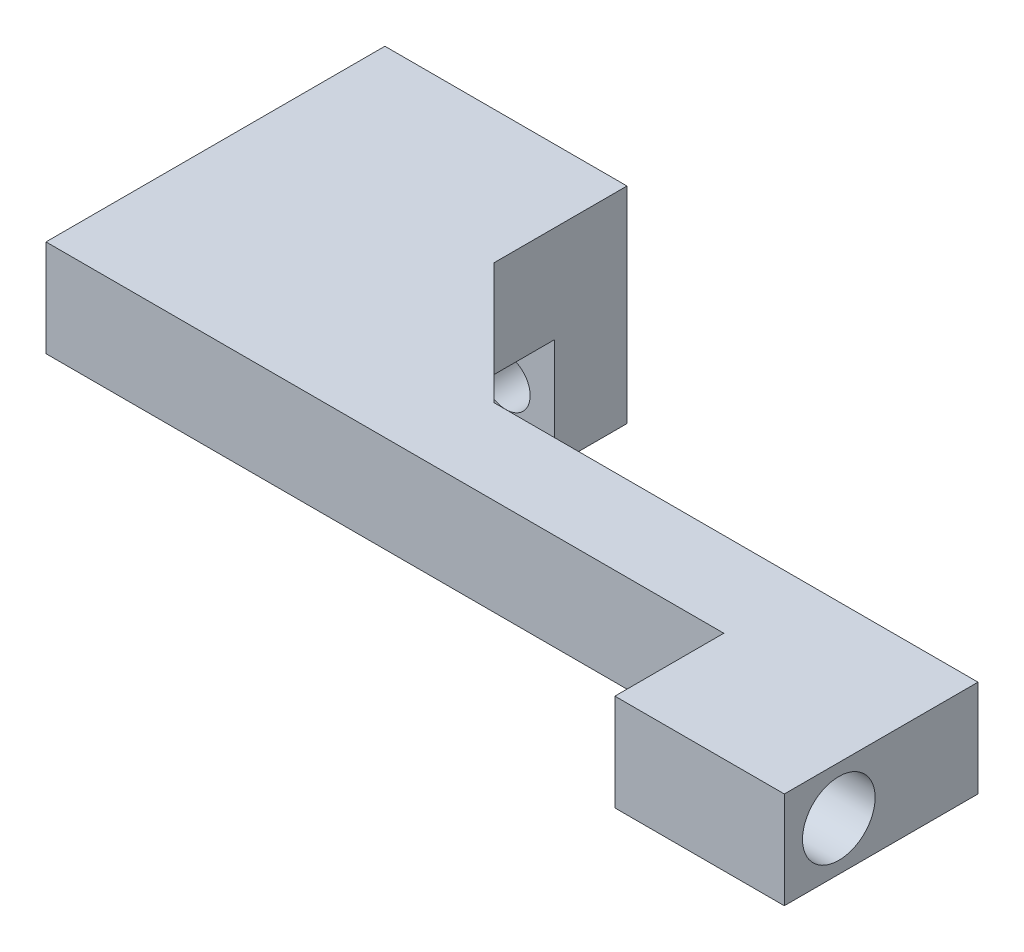
ISO-10303-21;
HEADER;
FILE_DESCRIPTION(('STEP AP214'),'2;1');
FILE_NAME('part.step','',(''),(''),'','','');
FILE_SCHEMA(('AUTOMOTIVE_DESIGN { 1 0 10303 214 1 1 1 1 }'));
ENDSEC;
DATA;
#1=APPLICATION_CONTEXT('core data for automotive mechanical design processes');
#2=APPLICATION_PROTOCOL_DEFINITION('international standard','automotive_design',2000,#1);
#3=PRODUCT_CONTEXT('',#1,'mechanical');
#4=PRODUCT('Part','Part','',(#3));
#5=PRODUCT_RELATED_PRODUCT_CATEGORY('part','',(#4));
#6=PRODUCT_DEFINITION_FORMATION('','',#4);
#7=PRODUCT_DEFINITION_CONTEXT('part definition',#1,'design');
#8=PRODUCT_DEFINITION('design','',#6,#7);
#9=PRODUCT_DEFINITION_SHAPE('','',#8);
#10=(LENGTH_UNIT() NAMED_UNIT(*) SI_UNIT(.MILLI.,.METRE.));
#11=(NAMED_UNIT(*) PLANE_ANGLE_UNIT() SI_UNIT($,.RADIAN.));
#12=(NAMED_UNIT(*) SI_UNIT($,.STERADIAN.) SOLID_ANGLE_UNIT());
#13=UNCERTAINTY_MEASURE_WITH_UNIT(LENGTH_MEASURE(1.E-05),#10,'distance_accuracy_value','');
#14=(GEOMETRIC_REPRESENTATION_CONTEXT(3) GLOBAL_UNCERTAINTY_ASSIGNED_CONTEXT((#13)) GLOBAL_UNIT_ASSIGNED_CONTEXT((#10,
#11,#12)) REPRESENTATION_CONTEXT('',''));
#15=CARTESIAN_POINT('',(0.,0.,0.));
#16=DIRECTION('',(0.,0.,1.));
#17=DIRECTION('',(1.,0.,0.));
#18=AXIS2_PLACEMENT_3D('',#15,#16,#17);
#19=CARTESIAN_POINT('',(0.,-8.,0.));
#20=DIRECTION('',(0.,1.,0.));
#21=DIRECTION('',(0.,0.,1.));
#22=AXIS2_PLACEMENT_3D('',#19,#20,#21);
#23=PLANE('',#22);
#24=DIRECTION('',(-1.,0.,0.));
#25=VECTOR('',#24,1.);
#26=CARTESIAN_POINT('',(20.,-8.,6.));
#27=LINE('',#26,#25);
#28=CARTESIAN_POINT('',(20.,-8.,6.));
#29=VERTEX_POINT('',#28);
#30=CARTESIAN_POINT('',(0.,-8.,6.));
#31=VERTEX_POINT('',#30);
#32=EDGE_CURVE('E50',#29,#31,#27,.T.);
#33=ORIENTED_EDGE('',*,*,#32,.F.);
#34=DIRECTION('',(0.,0.,-1.));
#35=VECTOR('',#34,1.);
#36=CARTESIAN_POINT('',(20.,-8.,11.));
#37=LINE('',#36,#35);
#38=CARTESIAN_POINT('',(20.,-8.,11.));
#39=VERTEX_POINT('',#38);
#40=EDGE_CURVE('E142',#39,#29,#37,.T.);
#41=ORIENTED_EDGE('',*,*,#40,.F.);
#42=DIRECTION('',(-0.707106781186546,0.,-0.707106781186549));
#43=VECTOR('',#42,1.);
#44=CARTESIAN_POINT('',(30.,-8.,21.));
#45=LINE('',#44,#43);
#46=CARTESIAN_POINT('',(30.,-8.,21.));
#47=VERTEX_POINT('',#46);
#48=EDGE_CURVE('E132',#47,#39,#45,.T.);
#49=ORIENTED_EDGE('',*,*,#48,.F.);
#50=DIRECTION('',(-1.,0.,0.));
#51=VECTOR('',#50,1.);
#52=CARTESIAN_POINT('',(70.,-8.,21.));
#53=LINE('',#52,#51);
#54=CARTESIAN_POINT('',(70.,-8.,21.));
#55=VERTEX_POINT('',#54);
#56=EDGE_CURVE('E117',#55,#47,#53,.T.);
#57=ORIENTED_EDGE('',*,*,#56,.F.);
#58=DIRECTION('',(0.,0.,-1.));
#59=VECTOR('',#58,1.);
#60=CARTESIAN_POINT('',(70.,-8.,37.));
#61=LINE('',#60,#59);
#62=CARTESIAN_POINT('',(70.,-8.,37.));
#63=VERTEX_POINT('',#62);
#64=EDGE_CURVE('E130',#63,#55,#61,.T.);
#65=ORIENTED_EDGE('',*,*,#64,.F.);
#66=DIRECTION('',(1.,0.,0.));
#67=VECTOR('',#66,1.);
#68=CARTESIAN_POINT('',(56.,-8.,37.));
#69=LINE('',#68,#67);
#70=CARTESIAN_POINT('',(56.,-8.,37.));
#71=VERTEX_POINT('',#70);
#72=EDGE_CURVE('E135',#71,#63,#69,.T.);
#73=ORIENTED_EDGE('',*,*,#72,.F.);
#74=DIRECTION('',(0.,0.,1.));
#75=VECTOR('',#74,1.);
#76=CARTESIAN_POINT('',(56.,-8.,28.));
#77=LINE('',#76,#75);
#78=CARTESIAN_POINT('',(56.,-8.,28.));
#79=VERTEX_POINT('',#78);
#80=EDGE_CURVE('E137',#79,#71,#77,.T.);
#81=ORIENTED_EDGE('',*,*,#80,.F.);
#82=DIRECTION('',(1.,0.,0.));
#83=VECTOR('',#82,1.);
#84=CARTESIAN_POINT('',(0.,-8.,28.));
#85=LINE('',#84,#83);
#86=CARTESIAN_POINT('',(0.,-8.,28.));
#87=VERTEX_POINT('',#86);
#88=EDGE_CURVE('E359',#87,#79,#85,.T.);
#89=ORIENTED_EDGE('',*,*,#88,.F.);
#90=DIRECTION('',(0.,0.,1.));
#91=VECTOR('',#90,1.);
#92=CARTESIAN_POINT('',(0.,-8.,0.));
#93=LINE('',#92,#91);
#94=EDGE_CURVE('E97',#31,#87,#93,.T.);
#95=ORIENTED_EDGE('',*,*,#94,.F.);
#96=EDGE_LOOP('',(#33,#41,#49,#57,#65,#73,#81,#89,#95));
#97=FACE_BOUND('',#96,.T.);
#98=ADVANCED_FACE('F33',(#97),#23,.F.);
#99=CARTESIAN_POINT('',(20.,-8.,0.));
#100=DIRECTION('',(0.,0.,-1.));
#101=DIRECTION('',(-1.,0.,0.));
#102=AXIS2_PLACEMENT_3D('',#99,#100,#101);
#103=PLANE('',#102);
#104=CARTESIAN_POINT('',(4.,-13.,0.));
#105=DIRECTION('',(0.,0.,-1.));
#106=DIRECTION('',(-1.,0.,0.));
#107=AXIS2_PLACEMENT_3D('',#104,#105,#106);
#108=CIRCLE('',#107,2.);
#109=CARTESIAN_POINT('',(2.,-13.,0.));
#110=VERTEX_POINT('',#109);
#111=EDGE_CURVE('E324',#110,#110,#108,.T.);
#112=ORIENTED_EDGE('',*,*,#111,.F.);
#113=EDGE_LOOP('',(#112));
#114=FACE_BOUND('',#113,.T.);
#115=CARTESIAN_POINT('',(16.,-13.,0.));
#116=DIRECTION('',(0.,0.,-1.));
#117=DIRECTION('',(-1.,0.,0.));
#118=AXIS2_PLACEMENT_3D('',#115,#116,#117);
#119=CIRCLE('',#118,2.);
#120=CARTESIAN_POINT('',(14.,-13.,0.));
#121=VERTEX_POINT('',#120);
#122=EDGE_CURVE('E328',#121,#121,#119,.T.);
#123=ORIENTED_EDGE('',*,*,#122,.F.);
#124=EDGE_LOOP('',(#123));
#125=FACE_BOUND('',#124,.T.);
#126=DIRECTION('',(-1.,0.,0.));
#127=VECTOR('',#126,1.);
#128=CARTESIAN_POINT('',(20.,0.,0.));
#129=LINE('',#128,#127);
#130=CARTESIAN_POINT('',(20.,0.,0.));
#131=VERTEX_POINT('',#130);
#132=CARTESIAN_POINT('',(0.,0.,0.));
#133=VERTEX_POINT('',#132);
#134=EDGE_CURVE('E144',#131,#133,#129,.T.);
#135=ORIENTED_EDGE('',*,*,#134,.F.);
#136=DIRECTION('',(0.,1.,0.));
#137=VECTOR('',#136,1.);
#138=CARTESIAN_POINT('',(20.,-8.,0.));
#139=LINE('',#138,#137);
#140=CARTESIAN_POINT('',(20.,-17.,0.));
#141=VERTEX_POINT('',#140);
#142=EDGE_CURVE('E11',#141,#131,#139,.T.);
#143=ORIENTED_EDGE('',*,*,#142,.F.);
#144=DIRECTION('',(-1.,0.,0.));
#145=VECTOR('',#144,1.);
#146=CARTESIAN_POINT('',(20.,-17.,0.));
#147=LINE('',#146,#145);
#148=CARTESIAN_POINT('',(0.,-17.,0.));
#149=VERTEX_POINT('',#148);
#150=EDGE_CURVE('E148',#141,#149,#147,.T.);
#151=ORIENTED_EDGE('',*,*,#150,.T.);
#152=DIRECTION('',(0.,1.,0.));
#153=VECTOR('',#152,1.);
#154=CARTESIAN_POINT('',(0.,-8.,0.));
#155=LINE('',#154,#153);
#156=EDGE_CURVE('E37',#149,#133,#155,.T.);
#157=ORIENTED_EDGE('',*,*,#156,.T.);
#158=EDGE_LOOP('',(#135,#143,#151,#157));
#159=FACE_BOUND('',#158,.T.);
#160=ADVANCED_FACE('F35',(#114,#125,#159),#103,.T.);
#161=CARTESIAN_POINT('',(20.,-8.,11.));
#162=DIRECTION('',(1.,0.,0.));
#163=DIRECTION('',(0.,0.,-1.));
#164=AXIS2_PLACEMENT_3D('',#161,#162,#163);
#165=PLANE('',#164);
#166=DIRECTION('',(0.,0.,-1.));
#167=VECTOR('',#166,1.);
#168=CARTESIAN_POINT('',(20.,0.,11.));
#169=LINE('',#168,#167);
#170=CARTESIAN_POINT('',(20.,0.,11.));
#171=VERTEX_POINT('',#170);
#172=EDGE_CURVE('E166',#171,#131,#169,.T.);
#173=ORIENTED_EDGE('',*,*,#172,.F.);
#174=DIRECTION('',(0.,1.,0.));
#175=VECTOR('',#174,1.);
#176=CARTESIAN_POINT('',(20.,-8.,11.));
#177=LINE('',#176,#175);
#178=EDGE_CURVE('E42',#39,#171,#177,.T.);
#179=ORIENTED_EDGE('',*,*,#178,.F.);
#180=ORIENTED_EDGE('',*,*,#40,.T.);
#181=DIRECTION('',(0.,1.,0.));
#182=VECTOR('',#181,1.);
#183=CARTESIAN_POINT('',(20.,-17.,6.));
#184=LINE('',#183,#182);
#185=CARTESIAN_POINT('',(20.,-17.,6.));
#186=VERTEX_POINT('',#185);
#187=EDGE_CURVE('E347',#186,#29,#184,.T.);
#188=ORIENTED_EDGE('',*,*,#187,.F.);
#189=DIRECTION('',(0.,0.,1.));
#190=VECTOR('',#189,1.);
#191=CARTESIAN_POINT('',(20.,-17.,0.));
#192=LINE('',#191,#190);
#193=EDGE_CURVE('E344',#141,#186,#192,.T.);
#194=ORIENTED_EDGE('',*,*,#193,.F.);
#195=ORIENTED_EDGE('',*,*,#142,.T.);
#196=EDGE_LOOP('',(#173,#179,#180,#188,#194,#195));
#197=FACE_BOUND('',#196,.T.);
#198=ADVANCED_FACE('F188',(#197),#165,.T.);
#199=CARTESIAN_POINT('',(30.,-8.,21.));
#200=DIRECTION('',(0.707106781186549,0.,-0.707106781186546));
#201=DIRECTION('',(-0.707106781186546,0.,-0.707106781186549));
#202=AXIS2_PLACEMENT_3D('',#199,#200,#201);
#203=PLANE('',#202);
#204=DIRECTION('',(-0.707106781186546,0.,-0.707106781186549));
#205=VECTOR('',#204,1.);
#206=CARTESIAN_POINT('',(30.,0.,21.));
#207=LINE('',#206,#205);
#208=CARTESIAN_POINT('',(30.,0.,21.));
#209=VERTEX_POINT('',#208);
#210=EDGE_CURVE('E163',#209,#171,#207,.T.);
#211=ORIENTED_EDGE('',*,*,#210,.F.);
#212=DIRECTION('',(0.,1.,0.));
#213=VECTOR('',#212,1.);
#214=CARTESIAN_POINT('',(30.,-8.,21.));
#215=LINE('',#214,#213);
#216=EDGE_CURVE('E124',#47,#209,#215,.T.);
#217=ORIENTED_EDGE('',*,*,#216,.F.);
#218=ORIENTED_EDGE('',*,*,#48,.T.);
#219=ORIENTED_EDGE('',*,*,#178,.T.);
#220=EDGE_LOOP('',(#211,#217,#218,#219));
#221=FACE_BOUND('',#220,.T.);
#222=ADVANCED_FACE('F190',(#221),#203,.T.);
#223=CARTESIAN_POINT('',(70.,-8.,21.));
#224=DIRECTION('',(0.,0.,-1.));
#225=DIRECTION('',(-1.,0.,0.));
#226=AXIS2_PLACEMENT_3D('',#223,#224,#225);
#227=PLANE('',#226);
#228=DIRECTION('',(-1.,0.,0.));
#229=VECTOR('',#228,1.);
#230=CARTESIAN_POINT('',(70.,0.,21.));
#231=LINE('',#230,#229);
#232=CARTESIAN_POINT('',(70.,0.,21.));
#233=VERTEX_POINT('',#232);
#234=EDGE_CURVE('E119',#233,#209,#231,.T.);
#235=ORIENTED_EDGE('',*,*,#234,.F.);
#236=DIRECTION('',(0.,1.,0.));
#237=VECTOR('',#236,1.);
#238=CARTESIAN_POINT('',(70.,-8.,21.));
#239=LINE('',#238,#237);
#240=EDGE_CURVE('E114',#55,#233,#239,.T.);
#241=ORIENTED_EDGE('',*,*,#240,.F.);
#242=ORIENTED_EDGE('',*,*,#56,.T.);
#243=ORIENTED_EDGE('',*,*,#216,.T.);
#244=EDGE_LOOP('',(#235,#241,#242,#243));
#245=FACE_BOUND('',#244,.T.);
#246=ADVANCED_FACE('F116',(#245),#227,.T.);
#247=CARTESIAN_POINT('',(70.,-8.,37.));
#248=DIRECTION('',(1.,0.,0.));
#249=DIRECTION('',(0.,0.,-1.));
#250=AXIS2_PLACEMENT_3D('',#247,#248,#249);
#251=PLANE('',#250);
#252=CARTESIAN_POINT('',(70.,-4.,32.5));
#253=DIRECTION('',(1.,0.,0.));
#254=DIRECTION('',(0.,0.,-1.));
#255=AXIS2_PLACEMENT_3D('',#252,#253,#254);
#256=CIRCLE('',#255,3.);
#257=CARTESIAN_POINT('',(70.,-4.,29.5));
#258=VERTEX_POINT('',#257);
#259=EDGE_CURVE('E337',#258,#258,#256,.F.);
#260=ORIENTED_EDGE('',*,*,#259,.T.);
#261=EDGE_LOOP('',(#260));
#262=FACE_BOUND('',#261,.T.);
#263=DIRECTION('',(0.,0.,-1.));
#264=VECTOR('',#263,1.);
#265=CARTESIAN_POINT('',(70.,0.,37.));
#266=LINE('',#265,#264);
#267=CARTESIAN_POINT('',(70.,0.,37.));
#268=VERTEX_POINT('',#267);
#269=EDGE_CURVE('E160',#268,#233,#266,.T.);
#270=ORIENTED_EDGE('',*,*,#269,.F.);
#271=DIRECTION('',(0.,1.,0.));
#272=VECTOR('',#271,1.);
#273=CARTESIAN_POINT('',(70.,-8.,37.));
#274=LINE('',#273,#272);
#275=EDGE_CURVE('E125',#63,#268,#274,.T.);
#276=ORIENTED_EDGE('',*,*,#275,.F.);
#277=ORIENTED_EDGE('',*,*,#64,.T.);
#278=ORIENTED_EDGE('',*,*,#240,.T.);
#279=EDGE_LOOP('',(#270,#276,#277,#278));
#280=FACE_BOUND('',#279,.T.);
#281=ADVANCED_FACE('F134',(#262,#280),#251,.T.);
#282=CARTESIAN_POINT('',(56.,-8.,37.));
#283=DIRECTION('',(0.,0.,1.));
#284=DIRECTION('',(1.,0.,0.));
#285=AXIS2_PLACEMENT_3D('',#282,#283,#284);
#286=PLANE('',#285);
#287=DIRECTION('',(1.,0.,0.));
#288=VECTOR('',#287,1.);
#289=CARTESIAN_POINT('',(56.,0.,37.));
#290=LINE('',#289,#288);
#291=CARTESIAN_POINT('',(56.,0.,37.));
#292=VERTEX_POINT('',#291);
#293=EDGE_CURVE('E157',#292,#268,#290,.T.);
#294=ORIENTED_EDGE('',*,*,#293,.F.);
#295=DIRECTION('',(0.,1.,0.));
#296=VECTOR('',#295,1.);
#297=CARTESIAN_POINT('',(56.,-8.,37.));
#298=LINE('',#297,#296);
#299=EDGE_CURVE('E172',#71,#292,#298,.T.);
#300=ORIENTED_EDGE('',*,*,#299,.F.);
#301=ORIENTED_EDGE('',*,*,#72,.T.);
#302=ORIENTED_EDGE('',*,*,#275,.T.);
#303=EDGE_LOOP('',(#294,#300,#301,#302));
#304=FACE_BOUND('',#303,.T.);
#305=ADVANCED_FACE('F225',(#304),#286,.T.);
#306=CARTESIAN_POINT('',(56.,-8.,28.));
#307=DIRECTION('',(-1.,0.,0.));
#308=DIRECTION('',(0.,0.,1.));
#309=AXIS2_PLACEMENT_3D('',#306,#307,#308);
#310=PLANE('',#309);
#311=CARTESIAN_POINT('',(56.,-4.,32.5));
#312=DIRECTION('',(-1.,0.,0.));
#313=DIRECTION('',(0.,0.,1.));
#314=AXIS2_PLACEMENT_3D('',#311,#312,#313);
#315=CIRCLE('',#314,3.);
#316=CARTESIAN_POINT('',(56.,-4.,35.5));
#317=VERTEX_POINT('',#316);
#318=EDGE_CURVE('E338',#317,#317,#315,.T.);
#319=ORIENTED_EDGE('',*,*,#318,.F.);
#320=EDGE_LOOP('',(#319));
#321=FACE_BOUND('',#320,.T.);
#322=DIRECTION('',(0.,0.,1.));
#323=VECTOR('',#322,1.);
#324=CARTESIAN_POINT('',(56.,0.,28.));
#325=LINE('',#324,#323);
#326=CARTESIAN_POINT('',(56.,0.,28.));
#327=VERTEX_POINT('',#326);
#328=EDGE_CURVE('E154',#327,#292,#325,.T.);
#329=ORIENTED_EDGE('',*,*,#328,.F.);
#330=DIRECTION('',(0.,1.,0.));
#331=VECTOR('',#330,1.);
#332=CARTESIAN_POINT('',(56.,-8.,28.));
#333=LINE('',#332,#331);
#334=EDGE_CURVE('E174',#79,#327,#333,.T.);
#335=ORIENTED_EDGE('',*,*,#334,.F.);
#336=ORIENTED_EDGE('',*,*,#80,.T.);
#337=ORIENTED_EDGE('',*,*,#299,.T.);
#338=EDGE_LOOP('',(#329,#335,#336,#337));
#339=FACE_BOUND('',#338,.T.);
#340=ADVANCED_FACE('F219',(#321,#339),#310,.T.);
#341=CARTESIAN_POINT('',(0.,-8.,28.));
#342=DIRECTION('',(0.,0.,1.));
#343=DIRECTION('',(1.,0.,0.));
#344=AXIS2_PLACEMENT_3D('',#341,#342,#343);
#345=PLANE('',#344);
#346=DIRECTION('',(1.,0.,0.));
#347=VECTOR('',#346,1.);
#348=CARTESIAN_POINT('',(0.,0.,28.));
#349=LINE('',#348,#347);
#350=CARTESIAN_POINT('',(0.,0.,28.));
#351=VERTEX_POINT('',#350);
#352=EDGE_CURVE('E151',#351,#327,#349,.T.);
#353=ORIENTED_EDGE('',*,*,#352,.F.);
#354=DIRECTION('',(0.,1.,0.));
#355=VECTOR('',#354,1.);
#356=CARTESIAN_POINT('',(0.,-8.,28.));
#357=LINE('',#356,#355);
#358=EDGE_CURVE('E175',#87,#351,#357,.T.);
#359=ORIENTED_EDGE('',*,*,#358,.F.);
#360=ORIENTED_EDGE('',*,*,#88,.T.);
#361=ORIENTED_EDGE('',*,*,#334,.T.);
#362=EDGE_LOOP('',(#353,#359,#360,#361));
#363=FACE_BOUND('',#362,.T.);
#364=ADVANCED_FACE('F215',(#363),#345,.T.);
#365=CARTESIAN_POINT('',(0.,-8.,0.));
#366=DIRECTION('',(-1.,0.,0.));
#367=DIRECTION('',(0.,0.,1.));
#368=AXIS2_PLACEMENT_3D('',#365,#366,#367);
#369=PLANE('',#368);
#370=DIRECTION('',(0.,0.,1.));
#371=VECTOR('',#370,1.);
#372=CARTESIAN_POINT('',(0.,0.,0.));
#373=LINE('',#372,#371);
#374=EDGE_CURVE('E147',#133,#351,#373,.T.);
#375=ORIENTED_EDGE('',*,*,#374,.F.);
#376=ORIENTED_EDGE('',*,*,#156,.F.);
#377=DIRECTION('',(0.,0.,1.));
#378=VECTOR('',#377,1.);
#379=CARTESIAN_POINT('',(0.,-17.,0.));
#380=LINE('',#379,#378);
#381=CARTESIAN_POINT('',(0.,-17.,6.));
#382=VERTEX_POINT('',#381);
#383=EDGE_CURVE('E341',#149,#382,#380,.T.);
#384=ORIENTED_EDGE('',*,*,#383,.T.);
#385=DIRECTION('',(0.,1.,0.));
#386=VECTOR('',#385,1.);
#387=CARTESIAN_POINT('',(0.,-17.,6.));
#388=LINE('',#387,#386);
#389=EDGE_CURVE('E348',#382,#31,#388,.T.);
#390=ORIENTED_EDGE('',*,*,#389,.T.);
#391=ORIENTED_EDGE('',*,*,#94,.T.);
#392=ORIENTED_EDGE('',*,*,#358,.T.);
#393=EDGE_LOOP('',(#375,#376,#384,#390,#391,#392));
#394=FACE_BOUND('',#393,.T.);
#395=ADVANCED_FACE('F184',(#394),#369,.T.);
#396=CARTESIAN_POINT('',(0.,0.,0.));
#397=DIRECTION('',(0.,1.,0.));
#398=DIRECTION('',(0.,0.,1.));
#399=AXIS2_PLACEMENT_3D('',#396,#397,#398);
#400=PLANE('',#399);
#401=ORIENTED_EDGE('',*,*,#134,.T.);
#402=ORIENTED_EDGE('',*,*,#374,.T.);
#403=ORIENTED_EDGE('',*,*,#352,.T.);
#404=ORIENTED_EDGE('',*,*,#328,.T.);
#405=ORIENTED_EDGE('',*,*,#293,.T.);
#406=ORIENTED_EDGE('',*,*,#269,.T.);
#407=ORIENTED_EDGE('',*,*,#234,.T.);
#408=ORIENTED_EDGE('',*,*,#210,.T.);
#409=ORIENTED_EDGE('',*,*,#172,.T.);
#410=EDGE_LOOP('',(#401,#402,#403,#404,#405,#406,#407,#408,#409));
#411=FACE_BOUND('',#410,.T.);
#412=ADVANCED_FACE('F186',(#411),#400,.T.);
#413=CARTESIAN_POINT('',(20.,-17.,0.));
#414=DIRECTION('',(0.,-1.,0.));
#415=DIRECTION('',(0.,0.,-1.));
#416=AXIS2_PLACEMENT_3D('',#413,#414,#415);
#417=PLANE('',#416);
#418=ORIENTED_EDGE('',*,*,#383,.F.);
#419=ORIENTED_EDGE('',*,*,#150,.F.);
#420=ORIENTED_EDGE('',*,*,#193,.T.);
#421=DIRECTION('',(-1.,0.,0.));
#422=VECTOR('',#421,1.);
#423=CARTESIAN_POINT('',(20.,-17.,6.));
#424=LINE('',#423,#422);
#425=EDGE_CURVE('E351',#186,#382,#424,.T.);
#426=ORIENTED_EDGE('',*,*,#425,.T.);
#427=EDGE_LOOP('',(#418,#419,#420,#426));
#428=FACE_BOUND('',#427,.T.);
#429=ADVANCED_FACE('F206',(#428),#417,.T.);
#430=CARTESIAN_POINT('',(20.,-17.,6.));
#431=DIRECTION('',(0.,0.,1.));
#432=DIRECTION('',(1.,0.,0.));
#433=AXIS2_PLACEMENT_3D('',#430,#431,#432);
#434=PLANE('',#433);
#435=CARTESIAN_POINT('',(4.,-13.,6.));
#436=DIRECTION('',(0.,0.,1.));
#437=DIRECTION('',(1.,0.,0.));
#438=AXIS2_PLACEMENT_3D('',#435,#436,#437);
#439=CIRCLE('',#438,2.);
#440=CARTESIAN_POINT('',(6.,-13.,6.));
#441=VERTEX_POINT('',#440);
#442=EDGE_CURVE('E327',#441,#441,#439,.T.);
#443=ORIENTED_EDGE('',*,*,#442,.F.);
#444=EDGE_LOOP('',(#443));
#445=FACE_BOUND('',#444,.T.);
#446=CARTESIAN_POINT('',(16.,-13.,6.));
#447=DIRECTION('',(0.,0.,1.));
#448=DIRECTION('',(1.,0.,0.));
#449=AXIS2_PLACEMENT_3D('',#446,#447,#448);
#450=CIRCLE('',#449,2.);
#451=CARTESIAN_POINT('',(18.,-13.,6.));
#452=VERTEX_POINT('',#451);
#453=EDGE_CURVE('E329',#452,#452,#450,.T.);
#454=ORIENTED_EDGE('',*,*,#453,.F.);
#455=EDGE_LOOP('',(#454));
#456=FACE_BOUND('',#455,.T.);
#457=ORIENTED_EDGE('',*,*,#389,.F.);
#458=ORIENTED_EDGE('',*,*,#425,.F.);
#459=ORIENTED_EDGE('',*,*,#187,.T.);
#460=ORIENTED_EDGE('',*,*,#32,.T.);
#461=EDGE_LOOP('',(#457,#458,#459,#460));
#462=FACE_BOUND('',#461,.T.);
#463=ADVANCED_FACE('F213',(#445,#456,#462),#434,.T.);
#464=CARTESIAN_POINT('',(70.001,-4.,32.5));
#465=DIRECTION('',(-1.,0.,0.));
#466=DIRECTION('',(0.,0.,1.));
#467=AXIS2_PLACEMENT_3D('',#464,#465,#466);
#468=CYLINDRICAL_SURFACE('',#467,3.);
#469=ORIENTED_EDGE('',*,*,#259,.F.);
#470=EDGE_LOOP('',(#469));
#471=FACE_BOUND('',#470,.T.);
#472=ORIENTED_EDGE('',*,*,#318,.T.);
#473=EDGE_LOOP('',(#472));
#474=FACE_BOUND('',#473,.T.);
#475=ADVANCED_FACE('F289',(#471,#474),#468,.F.);
#476=CARTESIAN_POINT('',(16.,-13.,-4.));
#477=DIRECTION('',(0.,0.,1.));
#478=DIRECTION('',(1.,0.,0.));
#479=AXIS2_PLACEMENT_3D('',#476,#477,#478);
#480=CYLINDRICAL_SURFACE('',#479,2.);
#481=ORIENTED_EDGE('',*,*,#122,.T.);
#482=EDGE_LOOP('',(#481));
#483=FACE_BOUND('',#482,.T.);
#484=ORIENTED_EDGE('',*,*,#453,.T.);
#485=EDGE_LOOP('',(#484));
#486=FACE_BOUND('',#485,.T.);
#487=ADVANCED_FACE('F298',(#483,#486),#480,.F.);
#488=CARTESIAN_POINT('',(4.,-13.,-4.));
#489=DIRECTION('',(0.,0.,1.));
#490=DIRECTION('',(1.,0.,0.));
#491=AXIS2_PLACEMENT_3D('',#488,#489,#490);
#492=CYLINDRICAL_SURFACE('',#491,2.);
#493=ORIENTED_EDGE('',*,*,#111,.T.);
#494=EDGE_LOOP('',(#493));
#495=FACE_BOUND('',#494,.T.);
#496=ORIENTED_EDGE('',*,*,#442,.T.);
#497=EDGE_LOOP('',(#496));
#498=FACE_BOUND('',#497,.T.);
#499=ADVANCED_FACE('F304',(#495,#498),#492,.F.);
#500=CLOSED_SHELL('',(#98,#160,#198,#222,#246,#281,#305,#340,#364,#395,#412,#429,#463,#475,#487,#499));
#501=MANIFOLD_SOLID_BREP('B2',#500);
#502=ADVANCED_BREP_SHAPE_REPRESENTATION('',(#18,#501),#14);
#503=SHAPE_DEFINITION_REPRESENTATION(#9,#502);
ENDSEC;
END-ISO-10303-21;
